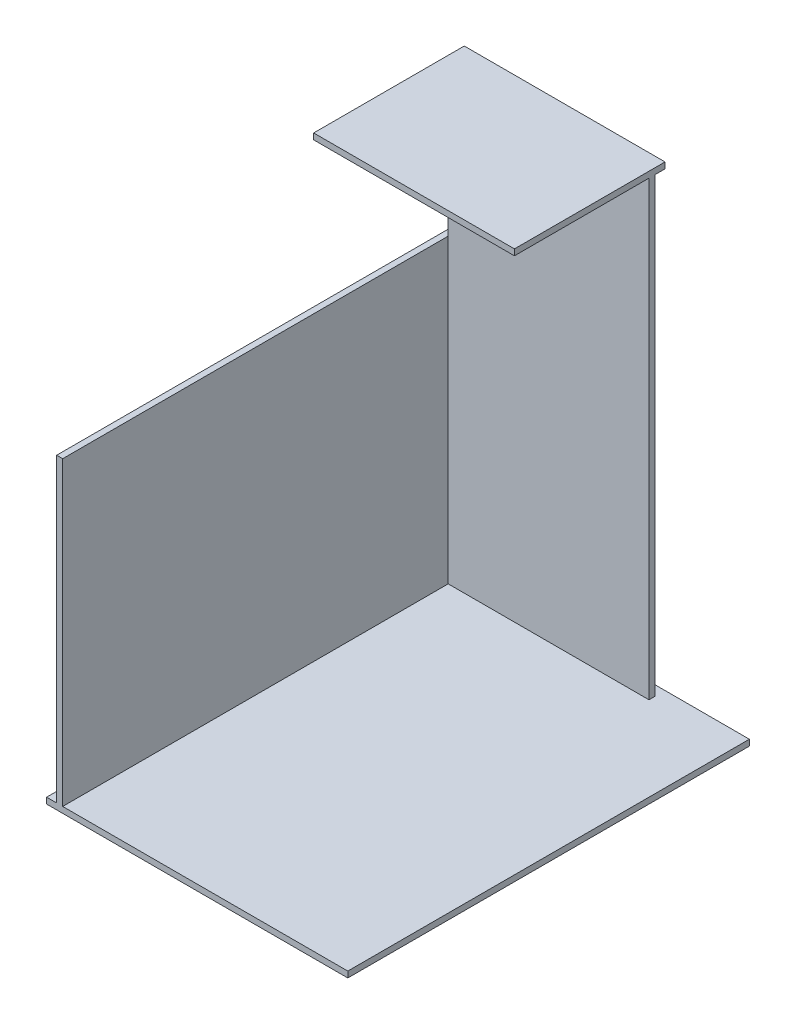
ISO-10303-21;
HEADER;
FILE_DESCRIPTION(('STEP AP214'),'2;1');
FILE_NAME('part.step','',(''),(''),'','','');
FILE_SCHEMA(('AUTOMOTIVE_DESIGN { 1 0 10303 214 1 1 1 1 }'));
ENDSEC;
DATA;
#1=APPLICATION_CONTEXT('core data for automotive mechanical design processes');
#2=APPLICATION_PROTOCOL_DEFINITION('international standard','automotive_design',2000,#1);
#3=PRODUCT_CONTEXT('',#1,'mechanical');
#4=PRODUCT('Part','Part','',(#3));
#5=PRODUCT_RELATED_PRODUCT_CATEGORY('part','',(#4));
#6=PRODUCT_DEFINITION_FORMATION('','',#4);
#7=PRODUCT_DEFINITION_CONTEXT('part definition',#1,'design');
#8=PRODUCT_DEFINITION('design','',#6,#7);
#9=PRODUCT_DEFINITION_SHAPE('','',#8);
#10=(LENGTH_UNIT() NAMED_UNIT(*) SI_UNIT(.MILLI.,.METRE.));
#11=(NAMED_UNIT(*) PLANE_ANGLE_UNIT() SI_UNIT($,.RADIAN.));
#12=(NAMED_UNIT(*) SI_UNIT($,.STERADIAN.) SOLID_ANGLE_UNIT());
#13=UNCERTAINTY_MEASURE_WITH_UNIT(LENGTH_MEASURE(1.E-05),#10,'distance_accuracy_value','');
#14=(GEOMETRIC_REPRESENTATION_CONTEXT(3) GLOBAL_UNCERTAINTY_ASSIGNED_CONTEXT((#13)) GLOBAL_UNIT_ASSIGNED_CONTEXT((#10,
#11,#12)) REPRESENTATION_CONTEXT('',''));
#15=CARTESIAN_POINT('',(0.,0.,0.));
#16=DIRECTION('',(0.,0.,1.));
#17=DIRECTION('',(1.,0.,0.));
#18=AXIS2_PLACEMENT_3D('',#15,#16,#17);
#19=CARTESIAN_POINT('',(-134.,306.,-200.));
#20=DIRECTION('',(-1.,0.,0.));
#21=DIRECTION('',(0.,0.,1.));
#22=AXIS2_PLACEMENT_3D('',#19,#20,#21);
#23=PLANE('',#22);
#24=DIRECTION('',(0.,-1.,0.));
#25=VECTOR('',#24,1.);
#26=CARTESIAN_POINT('',(-134.,456.,-184.));
#27=LINE('',#26,#25);
#28=CARTESIAN_POINT('',(-134.,306.,-184.));
#29=VERTEX_POINT('',#28);
#30=CARTESIAN_POINT('',(-134.,6.,-184.));
#31=VERTEX_POINT('',#30);
#32=EDGE_CURVE('E210',#29,#31,#27,.T.);
#33=ORIENTED_EDGE('',*,*,#32,.F.);
#34=DIRECTION('',(0.,0.,-1.));
#35=VECTOR('',#34,1.);
#36=CARTESIAN_POINT('',(-134.,306.,-200.));
#37=LINE('',#36,#35);
#38=CARTESIAN_POINT('',(-134.,306.,200.));
#39=VERTEX_POINT('',#38);
#40=EDGE_CURVE('E217',#39,#29,#37,.T.);
#41=ORIENTED_EDGE('',*,*,#40,.F.);
#42=DIRECTION('',(0.,-1.,0.));
#43=VECTOR('',#42,1.);
#44=CARTESIAN_POINT('',(-134.,306.,200.));
#45=LINE('',#44,#43);
#46=CARTESIAN_POINT('',(-134.,6.,200.));
#47=VERTEX_POINT('',#46);
#48=EDGE_CURVE('E231',#39,#47,#45,.T.);
#49=ORIENTED_EDGE('',*,*,#48,.T.);
#50=DIRECTION('',(0.,0.,-1.));
#51=VECTOR('',#50,1.);
#52=CARTESIAN_POINT('',(-134.,6.,-200.));
#53=LINE('',#52,#51);
#54=EDGE_CURVE('E64',#47,#31,#53,.T.);
#55=ORIENTED_EDGE('',*,*,#54,.T.);
#56=EDGE_LOOP('',(#33,#41,#49,#55));
#57=FACE_BOUND('',#56,.T.);
#58=ADVANCED_FACE('F36',(#57),#23,.F.);
#59=CARTESIAN_POINT('',(0.,6.,0.));
#60=DIRECTION('',(0.,1.,0.));
#61=DIRECTION('',(0.,0.,1.));
#62=AXIS2_PLACEMENT_3D('',#59,#60,#61);
#63=PLANE('',#62);
#64=DIRECTION('',(0.,0.,1.));
#65=VECTOR('',#64,1.);
#66=CARTESIAN_POINT('',(-140.,6.,-200.));
#67=LINE('',#66,#65);
#68=CARTESIAN_POINT('',(-140.,6.,-200.));
#69=VERTEX_POINT('',#68);
#70=CARTESIAN_POINT('',(-140.,6.,200.));
#71=VERTEX_POINT('',#70);
#72=EDGE_CURVE('E211',#69,#71,#67,.T.);
#73=ORIENTED_EDGE('',*,*,#72,.F.);
#74=DIRECTION('',(-1.,0.,0.));
#75=VECTOR('',#74,1.);
#76=CARTESIAN_POINT('',(-150.,6.,-200.));
#77=LINE('',#76,#75);
#78=CARTESIAN_POINT('',(-150.,6.,-200.));
#79=VERTEX_POINT('',#78);
#80=EDGE_CURVE('E243',#69,#79,#77,.T.);
#81=ORIENTED_EDGE('',*,*,#80,.T.);
#82=DIRECTION('',(0.,0.,1.));
#83=VECTOR('',#82,1.);
#84=CARTESIAN_POINT('',(-150.,6.,-200.));
#85=LINE('',#84,#83);
#86=CARTESIAN_POINT('',(-150.,6.,200.));
#87=VERTEX_POINT('',#86);
#88=EDGE_CURVE('E247',#79,#87,#85,.T.);
#89=ORIENTED_EDGE('',*,*,#88,.T.);
#90=DIRECTION('',(1.,0.,0.));
#91=VECTOR('',#90,1.);
#92=CARTESIAN_POINT('',(-150.,6.,200.));
#93=LINE('',#92,#91);
#94=EDGE_CURVE('E252',#87,#71,#93,.T.);
#95=ORIENTED_EDGE('',*,*,#94,.T.);
#96=EDGE_LOOP('',(#73,#81,#89,#95));
#97=FACE_BOUND('',#96,.T.);
#98=ADVANCED_FACE('F305',(#97),#63,.T.);
#99=CARTESIAN_POINT('',(150.,6.,-200.));
#100=DIRECTION('',(-1.,0.,0.));
#101=DIRECTION('',(0.,0.,1.));
#102=AXIS2_PLACEMENT_3D('',#99,#100,#101);
#103=PLANE('',#102);
#104=DIRECTION('',(0.,0.,-1.));
#105=VECTOR('',#104,1.);
#106=CARTESIAN_POINT('',(150.,0.,-200.));
#107=LINE('',#106,#105);
#108=CARTESIAN_POINT('',(150.,0.,200.));
#109=VERTEX_POINT('',#108);
#110=CARTESIAN_POINT('',(150.,0.,-200.));
#111=VERTEX_POINT('',#110);
#112=EDGE_CURVE('E238',#109,#111,#107,.T.);
#113=ORIENTED_EDGE('',*,*,#112,.T.);
#114=DIRECTION('',(0.,-1.,0.));
#115=VECTOR('',#114,1.);
#116=CARTESIAN_POINT('',(150.,6.,-200.));
#117=LINE('',#116,#115);
#118=CARTESIAN_POINT('',(150.,6.,-200.));
#119=VERTEX_POINT('',#118);
#120=EDGE_CURVE('E11',#119,#111,#117,.T.);
#121=ORIENTED_EDGE('',*,*,#120,.F.);
#122=DIRECTION('',(0.,0.,-1.));
#123=VECTOR('',#122,1.);
#124=CARTESIAN_POINT('',(150.,6.,-200.));
#125=LINE('',#124,#123);
#126=CARTESIAN_POINT('',(150.,6.,200.));
#127=VERTEX_POINT('',#126);
#128=EDGE_CURVE('E244',#127,#119,#125,.T.);
#129=ORIENTED_EDGE('',*,*,#128,.F.);
#130=DIRECTION('',(0.,-1.,0.));
#131=VECTOR('',#130,1.);
#132=CARTESIAN_POINT('',(150.,6.,200.));
#133=LINE('',#132,#131);
#134=EDGE_CURVE('E255',#127,#109,#133,.T.);
#135=ORIENTED_EDGE('',*,*,#134,.T.);
#136=EDGE_LOOP('',(#113,#121,#129,#135));
#137=FACE_BOUND('',#136,.T.);
#138=ADVANCED_FACE('F37',(#137),#103,.F.);
#139=CARTESIAN_POINT('',(-150.,6.,-200.));
#140=DIRECTION('',(0.,0.,1.));
#141=DIRECTION('',(1.,0.,0.));
#142=AXIS2_PLACEMENT_3D('',#139,#140,#141);
#143=PLANE('',#142);
#144=DIRECTION('',(-1.,0.,0.));
#145=VECTOR('',#144,1.);
#146=CARTESIAN_POINT('',(-150.,0.,-200.));
#147=LINE('',#146,#145);
#148=CARTESIAN_POINT('',(-150.,0.,-200.));
#149=VERTEX_POINT('',#148);
#150=EDGE_CURVE('E260',#111,#149,#147,.T.);
#151=ORIENTED_EDGE('',*,*,#150,.T.);
#152=DIRECTION('',(0.,-1.,0.));
#153=VECTOR('',#152,1.);
#154=CARTESIAN_POINT('',(-150.,6.,-200.));
#155=LINE('',#154,#153);
#156=EDGE_CURVE('E46',#79,#149,#155,.T.);
#157=ORIENTED_EDGE('',*,*,#156,.F.);
#158=ORIENTED_EDGE('',*,*,#80,.F.);
#159=DIRECTION('',(0.,-1.,0.));
#160=VECTOR('',#159,1.);
#161=CARTESIAN_POINT('',(-140.,306.,-200.));
#162=LINE('',#161,#160);
#163=CARTESIAN_POINT('',(-140.,306.,-200.));
#164=VERTEX_POINT('',#163);
#165=EDGE_CURVE('E221',#164,#69,#162,.T.);
#166=ORIENTED_EDGE('',*,*,#165,.F.);
#167=DIRECTION('',(-1.,0.,0.));
#168=VECTOR('',#167,1.);
#169=CARTESIAN_POINT('',(-140.,306.,-200.));
#170=LINE('',#169,#168);
#171=CARTESIAN_POINT('',(-134.,306.,-200.));
#172=VERTEX_POINT('',#171);
#173=EDGE_CURVE('E222',#172,#164,#170,.T.);
#174=ORIENTED_EDGE('',*,*,#173,.F.);
#175=DIRECTION('',(0.,-1.,0.));
#176=VECTOR('',#175,1.);
#177=CARTESIAN_POINT('',(-134.,306.,-200.));
#178=LINE('',#177,#176);
#179=CARTESIAN_POINT('',(-134.,6.,-200.));
#180=VERTEX_POINT('',#179);
#181=EDGE_CURVE('E232',#172,#180,#178,.T.);
#182=ORIENTED_EDGE('',*,*,#181,.T.);
#183=EDGE_CURVE('E246',#119,#180,#77,.T.);
#184=ORIENTED_EDGE('',*,*,#183,.F.);
#185=ORIENTED_EDGE('',*,*,#120,.T.);
#186=EDGE_LOOP('',(#151,#157,#158,#166,#174,#182,#184,#185));
#187=FACE_BOUND('',#186,.T.);
#188=ADVANCED_FACE('F303',(#187),#143,.F.);
#189=CARTESIAN_POINT('',(-150.,6.,-200.));
#190=DIRECTION('',(1.,0.,0.));
#191=DIRECTION('',(0.,0.,-1.));
#192=AXIS2_PLACEMENT_3D('',#189,#190,#191);
#193=PLANE('',#192);
#194=DIRECTION('',(0.,0.,1.));
#195=VECTOR('',#194,1.);
#196=CARTESIAN_POINT('',(-150.,0.,-200.));
#197=LINE('',#196,#195);
#198=CARTESIAN_POINT('',(-150.,0.,200.));
#199=VERTEX_POINT('',#198);
#200=EDGE_CURVE('E259',#149,#199,#197,.T.);
#201=ORIENTED_EDGE('',*,*,#200,.T.);
#202=DIRECTION('',(0.,-1.,0.));
#203=VECTOR('',#202,1.);
#204=CARTESIAN_POINT('',(-150.,6.,200.));
#205=LINE('',#204,#203);
#206=EDGE_CURVE('E262',#87,#199,#205,.T.);
#207=ORIENTED_EDGE('',*,*,#206,.F.);
#208=ORIENTED_EDGE('',*,*,#88,.F.);
#209=ORIENTED_EDGE('',*,*,#156,.T.);
#210=EDGE_LOOP('',(#201,#207,#208,#209));
#211=FACE_BOUND('',#210,.T.);
#212=ADVANCED_FACE('F271',(#211),#193,.F.);
#213=CARTESIAN_POINT('',(-150.,6.,200.));
#214=DIRECTION('',(0.,0.,-1.));
#215=DIRECTION('',(-1.,0.,0.));
#216=AXIS2_PLACEMENT_3D('',#213,#214,#215);
#217=PLANE('',#216);
#218=DIRECTION('',(1.,0.,0.));
#219=VECTOR('',#218,1.);
#220=CARTESIAN_POINT('',(-150.,0.,200.));
#221=LINE('',#220,#219);
#222=EDGE_CURVE('E242',#199,#109,#221,.T.);
#223=ORIENTED_EDGE('',*,*,#222,.T.);
#224=ORIENTED_EDGE('',*,*,#134,.F.);
#225=EDGE_CURVE('E253',#47,#127,#93,.T.);
#226=ORIENTED_EDGE('',*,*,#225,.F.);
#227=ORIENTED_EDGE('',*,*,#48,.F.);
#228=DIRECTION('',(1.,0.,0.));
#229=VECTOR('',#228,1.);
#230=CARTESIAN_POINT('',(-140.,306.,200.));
#231=LINE('',#230,#229);
#232=CARTESIAN_POINT('',(-140.,306.,200.));
#233=VERTEX_POINT('',#232);
#234=EDGE_CURVE('E214',#233,#39,#231,.T.);
#235=ORIENTED_EDGE('',*,*,#234,.F.);
#236=DIRECTION('',(0.,-1.,0.));
#237=VECTOR('',#236,1.);
#238=CARTESIAN_POINT('',(-140.,306.,200.));
#239=LINE('',#238,#237);
#240=EDGE_CURVE('E240',#233,#71,#239,.T.);
#241=ORIENTED_EDGE('',*,*,#240,.T.);
#242=ORIENTED_EDGE('',*,*,#94,.F.);
#243=ORIENTED_EDGE('',*,*,#206,.T.);
#244=EDGE_LOOP('',(#223,#224,#226,#227,#235,#241,#242,#243));
#245=FACE_BOUND('',#244,.T.);
#246=ADVANCED_FACE('F284',(#245),#217,.F.);
#247=DIRECTION('',(-1.,0.,0.));
#248=VECTOR('',#247,1.);
#249=CARTESIAN_POINT('',(-134.,6.,-190.));
#250=LINE('',#249,#248);
#251=CARTESIAN_POINT('',(66.0000000000001,6.,-190.));
#252=VERTEX_POINT('',#251);
#253=CARTESIAN_POINT('',(-134.,6.,-190.));
#254=VERTEX_POINT('',#253);
#255=EDGE_CURVE('E192',#252,#254,#250,.T.);
#256=ORIENTED_EDGE('',*,*,#255,.F.);
#257=DIRECTION('',(0.,0.,-1.));
#258=VECTOR('',#257,1.);
#259=CARTESIAN_POINT('',(66.0000000000001,6.,-190.));
#260=LINE('',#259,#258);
#261=CARTESIAN_POINT('',(66.0000000000001,6.,-184.));
#262=VERTEX_POINT('',#261);
#263=EDGE_CURVE('E184',#262,#252,#260,.T.);
#264=ORIENTED_EDGE('',*,*,#263,.F.);
#265=DIRECTION('',(1.,0.,0.));
#266=VECTOR('',#265,1.);
#267=CARTESIAN_POINT('',(-134.,6.,-184.));
#268=LINE('',#267,#266);
#269=EDGE_CURVE('E185',#31,#262,#268,.T.);
#270=ORIENTED_EDGE('',*,*,#269,.F.);
#271=ORIENTED_EDGE('',*,*,#54,.F.);
#272=ORIENTED_EDGE('',*,*,#225,.T.);
#273=ORIENTED_EDGE('',*,*,#128,.T.);
#274=ORIENTED_EDGE('',*,*,#183,.T.);
#275=EDGE_CURVE('E226',#254,#180,#53,.T.);
#276=ORIENTED_EDGE('',*,*,#275,.F.);
#277=EDGE_LOOP('',(#256,#264,#270,#271,#272,#273,#274,#276));
#278=FACE_BOUND('',#277,.T.);
#279=ADVANCED_FACE('F290',(#278),#63,.T.);
#280=CARTESIAN_POINT('',(0.,0.,0.));
#281=DIRECTION('',(0.,1.,0.));
#282=DIRECTION('',(0.,0.,1.));
#283=AXIS2_PLACEMENT_3D('',#280,#281,#282);
#284=PLANE('',#283);
#285=ORIENTED_EDGE('',*,*,#112,.F.);
#286=ORIENTED_EDGE('',*,*,#222,.F.);
#287=ORIENTED_EDGE('',*,*,#200,.F.);
#288=ORIENTED_EDGE('',*,*,#150,.F.);
#289=EDGE_LOOP('',(#285,#286,#287,#288));
#290=FACE_BOUND('',#289,.T.);
#291=ADVANCED_FACE('F279',(#290),#284,.F.);
#292=CARTESIAN_POINT('',(-140.,306.,-200.));
#293=DIRECTION('',(1.,0.,0.));
#294=DIRECTION('',(0.,0.,-1.));
#295=AXIS2_PLACEMENT_3D('',#292,#293,#294);
#296=PLANE('',#295);
#297=ORIENTED_EDGE('',*,*,#72,.T.);
#298=ORIENTED_EDGE('',*,*,#240,.F.);
#299=DIRECTION('',(0.,0.,1.));
#300=VECTOR('',#299,1.);
#301=CARTESIAN_POINT('',(-140.,306.,-200.));
#302=LINE('',#301,#300);
#303=EDGE_CURVE('E215',#164,#233,#302,.T.);
#304=ORIENTED_EDGE('',*,*,#303,.F.);
#305=ORIENTED_EDGE('',*,*,#165,.T.);
#306=EDGE_LOOP('',(#297,#298,#304,#305));
#307=FACE_BOUND('',#306,.T.);
#308=ADVANCED_FACE('F298',(#307),#296,.F.);
#309=CARTESIAN_POINT('',(-134.,306.,-190.));
#310=VERTEX_POINT('',#309);
#311=EDGE_CURVE('E220',#310,#172,#37,.T.);
#312=ORIENTED_EDGE('',*,*,#311,.F.);
#313=DIRECTION('',(0.,-1.,0.));
#314=VECTOR('',#313,1.);
#315=CARTESIAN_POINT('',(-134.,456.,-190.));
#316=LINE('',#315,#314);
#317=EDGE_CURVE('E198',#310,#254,#316,.T.);
#318=ORIENTED_EDGE('',*,*,#317,.T.);
#319=ORIENTED_EDGE('',*,*,#275,.T.);
#320=ORIENTED_EDGE('',*,*,#181,.F.);
#321=EDGE_LOOP('',(#312,#318,#319,#320));
#322=FACE_BOUND('',#321,.T.);
#323=ADVANCED_FACE('F310',(#322),#23,.F.);
#324=CARTESIAN_POINT('',(0.,306.,0.));
#325=DIRECTION('',(0.,1.,0.));
#326=DIRECTION('',(0.,0.,1.));
#327=AXIS2_PLACEMENT_3D('',#324,#325,#326);
#328=PLANE('',#327);
#329=ORIENTED_EDGE('',*,*,#303,.T.);
#330=ORIENTED_EDGE('',*,*,#234,.T.);
#331=ORIENTED_EDGE('',*,*,#40,.T.);
#332=EDGE_CURVE('E225',#29,#310,#37,.T.);
#333=ORIENTED_EDGE('',*,*,#332,.T.);
#334=ORIENTED_EDGE('',*,*,#311,.T.);
#335=ORIENTED_EDGE('',*,*,#173,.T.);
#336=EDGE_LOOP('',(#329,#330,#331,#333,#334,#335));
#337=FACE_BOUND('',#336,.T.);
#338=ADVANCED_FACE('F293',(#337),#328,.T.);
#339=CARTESIAN_POINT('',(-134.,456.,-190.));
#340=DIRECTION('',(1.,0.,0.));
#341=DIRECTION('',(0.,0.,-1.));
#342=AXIS2_PLACEMENT_3D('',#339,#340,#341);
#343=PLANE('',#342);
#344=ORIENTED_EDGE('',*,*,#332,.F.);
#345=CARTESIAN_POINT('',(-134.,456.,-184.));
#346=VERTEX_POINT('',#345);
#347=EDGE_CURVE('E208',#346,#29,#27,.T.);
#348=ORIENTED_EDGE('',*,*,#347,.F.);
#349=DIRECTION('',(0.,0.,1.));
#350=VECTOR('',#349,1.);
#351=CARTESIAN_POINT('',(-134.,456.,-200.));
#352=LINE('',#351,#350);
#353=CARTESIAN_POINT('',(-134.,456.,-49.9999999999999));
#354=VERTEX_POINT('',#353);
#355=EDGE_CURVE('E324',#346,#354,#352,.T.);
#356=ORIENTED_EDGE('',*,*,#355,.T.);
#357=DIRECTION('',(0.,-1.,0.));
#358=VECTOR('',#357,1.);
#359=CARTESIAN_POINT('',(-134.,462.,-49.9999999999999));
#360=LINE('',#359,#358);
#361=CARTESIAN_POINT('',(-134.,462.,-49.9999999999999));
#362=VERTEX_POINT('',#361);
#363=EDGE_CURVE('E189',#362,#354,#360,.T.);
#364=ORIENTED_EDGE('',*,*,#363,.F.);
#365=DIRECTION('',(0.,0.,1.));
#366=VECTOR('',#365,1.);
#367=CARTESIAN_POINT('',(-134.,462.,-200.));
#368=LINE('',#367,#366);
#369=CARTESIAN_POINT('',(-134.,462.,-200.));
#370=VERTEX_POINT('',#369);
#371=EDGE_CURVE('E170',#370,#362,#368,.T.);
#372=ORIENTED_EDGE('',*,*,#371,.F.);
#373=DIRECTION('',(0.,-1.,0.));
#374=VECTOR('',#373,1.);
#375=CARTESIAN_POINT('',(-134.,462.,-200.));
#376=LINE('',#375,#374);
#377=CARTESIAN_POINT('',(-134.,456.,-200.));
#378=VERTEX_POINT('',#377);
#379=EDGE_CURVE('E163',#370,#378,#376,.T.);
#380=ORIENTED_EDGE('',*,*,#379,.T.);
#381=CARTESIAN_POINT('',(-134.,456.,-190.));
#382=VERTEX_POINT('',#381);
#383=EDGE_CURVE('E326',#378,#382,#352,.T.);
#384=ORIENTED_EDGE('',*,*,#383,.T.);
#385=EDGE_CURVE('E199',#382,#310,#316,.T.);
#386=ORIENTED_EDGE('',*,*,#385,.T.);
#387=EDGE_LOOP('',(#344,#348,#356,#364,#372,#380,#384,#386));
#388=FACE_BOUND('',#387,.T.);
#389=ADVANCED_FACE('F344',(#388),#343,.F.);
#390=CARTESIAN_POINT('',(-134.,456.,-184.));
#391=DIRECTION('',(0.,0.,-1.));
#392=DIRECTION('',(-1.,0.,0.));
#393=AXIS2_PLACEMENT_3D('',#390,#391,#392);
#394=PLANE('',#393);
#395=ORIENTED_EDGE('',*,*,#269,.T.);
#396=DIRECTION('',(0.,-1.,0.));
#397=VECTOR('',#396,1.);
#398=CARTESIAN_POINT('',(66.0000000000001,456.,-184.));
#399=LINE('',#398,#397);
#400=CARTESIAN_POINT('',(66.0000000000001,456.,-184.));
#401=VERTEX_POINT('',#400);
#402=EDGE_CURVE('E52',#401,#262,#399,.T.);
#403=ORIENTED_EDGE('',*,*,#402,.F.);
#404=DIRECTION('',(1.,0.,0.));
#405=VECTOR('',#404,1.);
#406=CARTESIAN_POINT('',(-134.,456.,-184.));
#407=LINE('',#406,#405);
#408=EDGE_CURVE('E187',#346,#401,#407,.T.);
#409=ORIENTED_EDGE('',*,*,#408,.F.);
#410=ORIENTED_EDGE('',*,*,#347,.T.);
#411=ORIENTED_EDGE('',*,*,#32,.T.);
#412=EDGE_LOOP('',(#395,#403,#409,#410,#411));
#413=FACE_BOUND('',#412,.T.);
#414=ADVANCED_FACE('F345',(#413),#394,.F.);
#415=CARTESIAN_POINT('',(66.0000000000001,456.,-190.));
#416=DIRECTION('',(-1.,0.,0.));
#417=DIRECTION('',(0.,0.,1.));
#418=AXIS2_PLACEMENT_3D('',#415,#416,#417);
#419=PLANE('',#418);
#420=ORIENTED_EDGE('',*,*,#263,.T.);
#421=DIRECTION('',(0.,-1.,0.));
#422=VECTOR('',#421,1.);
#423=CARTESIAN_POINT('',(66.0000000000001,456.,-190.));
#424=LINE('',#423,#422);
#425=CARTESIAN_POINT('',(66.0000000000001,456.,-190.));
#426=VERTEX_POINT('',#425);
#427=EDGE_CURVE('E201',#426,#252,#424,.T.);
#428=ORIENTED_EDGE('',*,*,#427,.F.);
#429=DIRECTION('',(0.,0.,-1.));
#430=VECTOR('',#429,1.);
#431=CARTESIAN_POINT('',(66.,456.,-200.));
#432=LINE('',#431,#430);
#433=CARTESIAN_POINT('',(66.,456.,-200.));
#434=VERTEX_POINT('',#433);
#435=EDGE_CURVE('E178',#426,#434,#432,.T.);
#436=ORIENTED_EDGE('',*,*,#435,.T.);
#437=DIRECTION('',(0.,-1.,0.));
#438=VECTOR('',#437,1.);
#439=CARTESIAN_POINT('',(66.,462.,-200.));
#440=LINE('',#439,#438);
#441=CARTESIAN_POINT('',(66.,462.,-200.));
#442=VERTEX_POINT('',#441);
#443=EDGE_CURVE('E165',#442,#434,#440,.T.);
#444=ORIENTED_EDGE('',*,*,#443,.F.);
#445=DIRECTION('',(0.,0.,-1.));
#446=VECTOR('',#445,1.);
#447=CARTESIAN_POINT('',(66.,462.,-200.));
#448=LINE('',#447,#446);
#449=CARTESIAN_POINT('',(66.,462.,-50.));
#450=VERTEX_POINT('',#449);
#451=EDGE_CURVE('E169',#450,#442,#448,.T.);
#452=ORIENTED_EDGE('',*,*,#451,.F.);
#453=DIRECTION('',(0.,-1.,0.));
#454=VECTOR('',#453,1.);
#455=CARTESIAN_POINT('',(66.,462.,-50.));
#456=LINE('',#455,#454);
#457=CARTESIAN_POINT('',(66.,456.,-50.));
#458=VERTEX_POINT('',#457);
#459=EDGE_CURVE('E328',#450,#458,#456,.T.);
#460=ORIENTED_EDGE('',*,*,#459,.T.);
#461=EDGE_CURVE('E317',#458,#401,#432,.T.);
#462=ORIENTED_EDGE('',*,*,#461,.T.);
#463=ORIENTED_EDGE('',*,*,#402,.T.);
#464=EDGE_LOOP('',(#420,#428,#436,#444,#452,#460,#462,#463));
#465=FACE_BOUND('',#464,.T.);
#466=ADVANCED_FACE('F179',(#465),#419,.F.);
#467=CARTESIAN_POINT('',(-134.,456.,-190.));
#468=DIRECTION('',(0.,0.,1.));
#469=DIRECTION('',(1.,0.,0.));
#470=AXIS2_PLACEMENT_3D('',#467,#468,#469);
#471=PLANE('',#470);
#472=ORIENTED_EDGE('',*,*,#255,.T.);
#473=ORIENTED_EDGE('',*,*,#317,.F.);
#474=ORIENTED_EDGE('',*,*,#385,.F.);
#475=DIRECTION('',(-1.,0.,0.));
#476=VECTOR('',#475,1.);
#477=CARTESIAN_POINT('',(-134.,456.,-190.));
#478=LINE('',#477,#476);
#479=EDGE_CURVE('E193',#426,#382,#478,.T.);
#480=ORIENTED_EDGE('',*,*,#479,.F.);
#481=ORIENTED_EDGE('',*,*,#427,.T.);
#482=EDGE_LOOP('',(#472,#473,#474,#480,#481));
#483=FACE_BOUND('',#482,.T.);
#484=ADVANCED_FACE('F315',(#483),#471,.F.);
#485=CARTESIAN_POINT('',(0.,456.,0.));
#486=DIRECTION('',(0.,-1.,0.));
#487=DIRECTION('',(0.,0.,-1.));
#488=AXIS2_PLACEMENT_3D('',#485,#486,#487);
#489=PLANE('',#488);
#490=ORIENTED_EDGE('',*,*,#355,.F.);
#491=ORIENTED_EDGE('',*,*,#408,.T.);
#492=ORIENTED_EDGE('',*,*,#461,.F.);
#493=DIRECTION('',(1.,0.,0.));
#494=VECTOR('',#493,1.);
#495=CARTESIAN_POINT('',(66.,456.,-50.));
#496=LINE('',#495,#494);
#497=EDGE_CURVE('E177',#354,#458,#496,.T.);
#498=ORIENTED_EDGE('',*,*,#497,.F.);
#499=EDGE_LOOP('',(#490,#491,#492,#498));
#500=FACE_BOUND('',#499,.T.);
#501=ADVANCED_FACE('F338',(#500),#489,.T.);
#502=CARTESIAN_POINT('',(66.,462.,-200.));
#503=DIRECTION('',(0.,0.,1.));
#504=DIRECTION('',(1.,0.,0.));
#505=AXIS2_PLACEMENT_3D('',#502,#503,#504);
#506=PLANE('',#505);
#507=DIRECTION('',(-1.,0.,0.));
#508=VECTOR('',#507,1.);
#509=CARTESIAN_POINT('',(66.,456.,-200.));
#510=LINE('',#509,#508);
#511=EDGE_CURVE('E318',#434,#378,#510,.T.);
#512=ORIENTED_EDGE('',*,*,#511,.T.);
#513=ORIENTED_EDGE('',*,*,#379,.F.);
#514=DIRECTION('',(-1.,0.,0.));
#515=VECTOR('',#514,1.);
#516=CARTESIAN_POINT('',(66.,462.,-200.));
#517=LINE('',#516,#515);
#518=EDGE_CURVE('E158',#442,#370,#517,.T.);
#519=ORIENTED_EDGE('',*,*,#518,.F.);
#520=ORIENTED_EDGE('',*,*,#443,.T.);
#521=EDGE_LOOP('',(#512,#513,#519,#520));
#522=FACE_BOUND('',#521,.T.);
#523=ADVANCED_FACE('F159',(#522),#506,.F.);
#524=CARTESIAN_POINT('',(66.,462.,-50.));
#525=DIRECTION('',(0.,0.,-1.));
#526=DIRECTION('',(-1.,0.,0.));
#527=AXIS2_PLACEMENT_3D('',#524,#525,#526);
#528=PLANE('',#527);
#529=ORIENTED_EDGE('',*,*,#497,.T.);
#530=ORIENTED_EDGE('',*,*,#459,.F.);
#531=DIRECTION('',(1.,0.,0.));
#532=VECTOR('',#531,1.);
#533=CARTESIAN_POINT('',(66.,462.,-50.));
#534=LINE('',#533,#532);
#535=EDGE_CURVE('E175',#362,#450,#534,.T.);
#536=ORIENTED_EDGE('',*,*,#535,.F.);
#537=ORIENTED_EDGE('',*,*,#363,.T.);
#538=EDGE_LOOP('',(#529,#530,#536,#537));
#539=FACE_BOUND('',#538,.T.);
#540=ADVANCED_FACE('F331',(#539),#528,.F.);
#541=CARTESIAN_POINT('',(0.,462.,0.));
#542=DIRECTION('',(0.,-1.,0.));
#543=DIRECTION('',(0.,0.,-1.));
#544=AXIS2_PLACEMENT_3D('',#541,#542,#543);
#545=PLANE('',#544);
#546=ORIENTED_EDGE('',*,*,#451,.T.);
#547=ORIENTED_EDGE('',*,*,#518,.T.);
#548=ORIENTED_EDGE('',*,*,#371,.T.);
#549=ORIENTED_EDGE('',*,*,#535,.T.);
#550=EDGE_LOOP('',(#546,#547,#548,#549));
#551=FACE_BOUND('',#550,.T.);
#552=ADVANCED_FACE('F174',(#551),#545,.F.);
#553=ORIENTED_EDGE('',*,*,#435,.F.);
#554=ORIENTED_EDGE('',*,*,#479,.T.);
#555=ORIENTED_EDGE('',*,*,#383,.F.);
#556=ORIENTED_EDGE('',*,*,#511,.F.);
#557=EDGE_LOOP('',(#553,#554,#555,#556));
#558=FACE_BOUND('',#557,.T.);
#559=ADVANCED_FACE('F320',(#558),#489,.T.);
#560=CLOSED_SHELL('',(#58,#98,#138,#188,#212,#246,#279,#291,#308,#323,#338,#389,#414,#466,#484,
#501,#523,#540,#552,#559));
#561=MANIFOLD_SOLID_BREP('B2',#560);
#562=ADVANCED_BREP_SHAPE_REPRESENTATION('',(#18,#561),#14);
#563=SHAPE_DEFINITION_REPRESENTATION(#9,#562);
ENDSEC;
END-ISO-10303-21;
